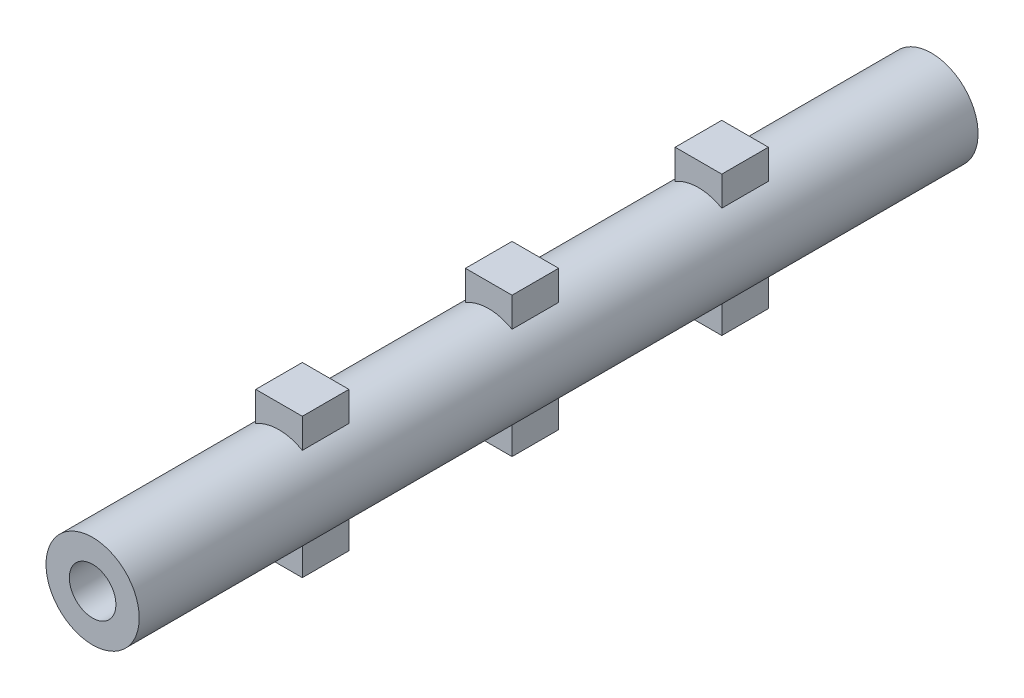
ISO-10303-21;
HEADER;
FILE_DESCRIPTION(('STEP AP214'),'2;1');
FILE_NAME('part.step','',(''),(''),'','','');
FILE_SCHEMA(('AUTOMOTIVE_DESIGN { 1 0 10303 214 1 1 1 1 }'));
ENDSEC;
DATA;
#1=APPLICATION_CONTEXT('core data for automotive mechanical design processes');
#2=APPLICATION_PROTOCOL_DEFINITION('international standard','automotive_design',2000,#1);
#3=PRODUCT_CONTEXT('',#1,'mechanical');
#4=PRODUCT('Part','Part','',(#3));
#5=PRODUCT_RELATED_PRODUCT_CATEGORY('part','',(#4));
#6=PRODUCT_DEFINITION_FORMATION('','',#4);
#7=PRODUCT_DEFINITION_CONTEXT('part definition',#1,'design');
#8=PRODUCT_DEFINITION('design','',#6,#7);
#9=PRODUCT_DEFINITION_SHAPE('','',#8);
#10=(LENGTH_UNIT() NAMED_UNIT(*) SI_UNIT(.MILLI.,.METRE.));
#11=(NAMED_UNIT(*) PLANE_ANGLE_UNIT() SI_UNIT($,.RADIAN.));
#12=(NAMED_UNIT(*) SI_UNIT($,.STERADIAN.) SOLID_ANGLE_UNIT());
#13=UNCERTAINTY_MEASURE_WITH_UNIT(LENGTH_MEASURE(1.E-05),#10,'distance_accuracy_value','');
#14=(GEOMETRIC_REPRESENTATION_CONTEXT(3) GLOBAL_UNCERTAINTY_ASSIGNED_CONTEXT((#13)) GLOBAL_UNIT_ASSIGNED_CONTEXT((#10,
#11,#12)) REPRESENTATION_CONTEXT('',''));
#15=CARTESIAN_POINT('',(0.,0.,0.));
#16=DIRECTION('',(0.,0.,1.));
#17=DIRECTION('',(1.,0.,0.));
#18=AXIS2_PLACEMENT_3D('',#15,#16,#17);
#19=CARTESIAN_POINT('',(0.,0.,25.));
#20=DIRECTION('',(0.,0.,1.));
#21=DIRECTION('',(1.,0.,0.));
#22=AXIS2_PLACEMENT_3D('',#19,#20,#21);
#23=PLANE('',#22);
#24=CARTESIAN_POINT('',(0.,0.,25.));
#25=DIRECTION('',(0.,0.,1.));
#26=DIRECTION('',(1.,0.,0.));
#27=AXIS2_PLACEMENT_3D('',#24,#25,#26);
#28=CIRCLE('',#27,5.);
#29=CARTESIAN_POINT('',(2.5,4.33012701892219,25.));
#30=VERTEX_POINT('',#29);
#31=CARTESIAN_POINT('',(-2.5,4.33012701892219,25.));
#32=VERTEX_POINT('',#31);
#33=EDGE_CURVE('E51',#30,#32,#28,.T.);
#34=ORIENTED_EDGE('',*,*,#33,.F.);
#35=DIRECTION('',(0.,1.,0.));
#36=VECTOR('',#35,1.);
#37=CARTESIAN_POINT('',(2.5,-7.5,25.));
#38=LINE('',#37,#36);
#39=CARTESIAN_POINT('',(2.5,7.5,25.));
#40=VERTEX_POINT('',#39);
#41=EDGE_CURVE('E220',#30,#40,#38,.T.);
#42=ORIENTED_EDGE('',*,*,#41,.T.);
#43=DIRECTION('',(-1.,0.,0.));
#44=VECTOR('',#43,1.);
#45=CARTESIAN_POINT('',(-2.5,7.5,25.));
#46=LINE('',#45,#44);
#47=CARTESIAN_POINT('',(-2.5,7.5,25.));
#48=VERTEX_POINT('',#47);
#49=EDGE_CURVE('E392',#40,#48,#46,.T.);
#50=ORIENTED_EDGE('',*,*,#49,.T.);
#51=DIRECTION('',(0.,-1.,0.));
#52=VECTOR('',#51,1.);
#53=CARTESIAN_POINT('',(-2.5,-7.5,25.));
#54=LINE('',#53,#52);
#55=EDGE_CURVE('E232',#48,#32,#54,.T.);
#56=ORIENTED_EDGE('',*,*,#55,.T.);
#57=EDGE_LOOP('',(#34,#42,#50,#56));
#58=FACE_BOUND('',#57,.T.);
#59=ADVANCED_FACE('F39',(#58),#23,.T.);
#60=CARTESIAN_POINT('',(0.,0.,-25.));
#61=DIRECTION('',(0.,0.,-1.));
#62=DIRECTION('',(-1.,0.,0.));
#63=AXIS2_PLACEMENT_3D('',#60,#61,#62);
#64=PLANE('',#63);
#65=CARTESIAN_POINT('',(0.,0.,-25.));
#66=DIRECTION('',(0.,0.,-1.));
#67=DIRECTION('',(-1.,0.,0.));
#68=AXIS2_PLACEMENT_3D('',#65,#66,#67);
#69=CIRCLE('',#68,5.);
#70=CARTESIAN_POINT('',(-2.5,4.33012701892219,-25.));
#71=VERTEX_POINT('',#70);
#72=CARTESIAN_POINT('',(2.5,4.33012701892219,-25.));
#73=VERTEX_POINT('',#72);
#74=EDGE_CURVE('E240',#71,#73,#69,.T.);
#75=ORIENTED_EDGE('',*,*,#74,.F.);
#76=DIRECTION('',(0.,1.,0.));
#77=VECTOR('',#76,1.);
#78=CARTESIAN_POINT('',(-2.5,-7.5,-25.));
#79=LINE('',#78,#77);
#80=CARTESIAN_POINT('',(-2.5,7.5,-25.));
#81=VERTEX_POINT('',#80);
#82=EDGE_CURVE('E278',#71,#81,#79,.T.);
#83=ORIENTED_EDGE('',*,*,#82,.T.);
#84=DIRECTION('',(1.,0.,0.));
#85=VECTOR('',#84,1.);
#86=CARTESIAN_POINT('',(-2.5,7.5,-25.));
#87=LINE('',#86,#85);
#88=CARTESIAN_POINT('',(2.5,7.5,-25.));
#89=VERTEX_POINT('',#88);
#90=EDGE_CURVE('E281',#81,#89,#87,.T.);
#91=ORIENTED_EDGE('',*,*,#90,.T.);
#92=DIRECTION('',(0.,-1.,0.));
#93=VECTOR('',#92,1.);
#94=CARTESIAN_POINT('',(2.5,-7.5,-25.));
#95=LINE('',#94,#93);
#96=EDGE_CURVE('E66',#89,#73,#95,.T.);
#97=ORIENTED_EDGE('',*,*,#96,.T.);
#98=EDGE_LOOP('',(#75,#83,#91,#97));
#99=FACE_BOUND('',#98,.T.);
#100=ADVANCED_FACE('F500',(#99),#64,.T.);
#101=CARTESIAN_POINT('',(2.5,-7.5,2.5));
#102=DIRECTION('',(1.,0.,0.));
#103=DIRECTION('',(0.,0.,-1.));
#104=AXIS2_PLACEMENT_3D('',#101,#102,#103);
#105=PLANE('',#104);
#106=DIRECTION('',(0.,0.,-1.));
#107=VECTOR('',#106,1.);
#108=CARTESIAN_POINT('',(2.5,4.33012701892219,25.));
#109=LINE('',#108,#107);
#110=CARTESIAN_POINT('',(2.5,4.33012701892219,-2.5));
#111=VERTEX_POINT('',#110);
#112=CARTESIAN_POINT('',(2.5,4.33012701892219,2.5));
#113=VERTEX_POINT('',#112);
#114=EDGE_CURVE('E352',#111,#113,#109,.F.);
#115=ORIENTED_EDGE('',*,*,#114,.F.);
#116=DIRECTION('',(0.,-1.,0.));
#117=VECTOR('',#116,1.);
#118=CARTESIAN_POINT('',(2.5,-7.5,-2.5));
#119=LINE('',#118,#117);
#120=CARTESIAN_POINT('',(2.5,7.5,-2.5));
#121=VERTEX_POINT('',#120);
#122=EDGE_CURVE('E322',#121,#111,#119,.T.);
#123=ORIENTED_EDGE('',*,*,#122,.F.);
#124=DIRECTION('',(0.,0.,-1.));
#125=VECTOR('',#124,1.);
#126=CARTESIAN_POINT('',(2.5,7.5,2.5));
#127=LINE('',#126,#125);
#128=CARTESIAN_POINT('',(2.5,7.5,2.5));
#129=VERTEX_POINT('',#128);
#130=EDGE_CURVE('E357',#129,#121,#127,.T.);
#131=ORIENTED_EDGE('',*,*,#130,.F.);
#132=DIRECTION('',(0.,-1.,0.));
#133=VECTOR('',#132,1.);
#134=CARTESIAN_POINT('',(2.5,-7.5,2.5));
#135=LINE('',#134,#133);
#136=EDGE_CURVE('E340',#129,#113,#135,.T.);
#137=ORIENTED_EDGE('',*,*,#136,.T.);
#138=EDGE_LOOP('',(#115,#123,#131,#137));
#139=FACE_BOUND('',#138,.T.);
#140=ADVANCED_FACE('F505',(#139),#105,.T.);
#141=CARTESIAN_POINT('',(2.5,-4.33012701892219,-2.5));
#142=VERTEX_POINT('',#141);
#143=CARTESIAN_POINT('',(2.5,-7.5,-2.5));
#144=VERTEX_POINT('',#143);
#145=EDGE_CURVE('E321',#142,#144,#119,.T.);
#146=ORIENTED_EDGE('',*,*,#145,.F.);
#147=DIRECTION('',(0.,0.,-1.));
#148=VECTOR('',#147,1.);
#149=CARTESIAN_POINT('',(2.5,-4.33012701892219,25.));
#150=LINE('',#149,#148);
#151=CARTESIAN_POINT('',(2.5,-4.33012701892219,2.5));
#152=VERTEX_POINT('',#151);
#153=EDGE_CURVE('E365',#152,#142,#150,.T.);
#154=ORIENTED_EDGE('',*,*,#153,.F.);
#155=CARTESIAN_POINT('',(2.5,-7.5,2.5));
#156=VERTEX_POINT('',#155);
#157=EDGE_CURVE('E339',#152,#156,#135,.T.);
#158=ORIENTED_EDGE('',*,*,#157,.T.);
#159=DIRECTION('',(0.,0.,-1.));
#160=VECTOR('',#159,1.);
#161=CARTESIAN_POINT('',(2.5,-7.5,2.5));
#162=LINE('',#161,#160);
#163=EDGE_CURVE('E353',#156,#144,#162,.T.);
#164=ORIENTED_EDGE('',*,*,#163,.T.);
#165=EDGE_LOOP('',(#146,#154,#158,#164));
#166=FACE_BOUND('',#165,.T.);
#167=ADVANCED_FACE('F561',(#166),#105,.T.);
#168=CARTESIAN_POINT('',(-2.5,-7.5,2.5));
#169=DIRECTION('',(-1.,0.,0.));
#170=DIRECTION('',(0.,0.,1.));
#171=AXIS2_PLACEMENT_3D('',#168,#169,#170);
#172=PLANE('',#171);
#173=DIRECTION('',(0.,0.,-1.));
#174=VECTOR('',#173,1.);
#175=CARTESIAN_POINT('',(-2.5,-4.33012701892219,25.));
#176=LINE('',#175,#174);
#177=CARTESIAN_POINT('',(-2.5,-4.33012701892219,-2.5));
#178=VERTEX_POINT('',#177);
#179=CARTESIAN_POINT('',(-2.5,-4.33012701892219,2.5));
#180=VERTEX_POINT('',#179);
#181=EDGE_CURVE('E368',#178,#180,#176,.F.);
#182=ORIENTED_EDGE('',*,*,#181,.F.);
#183=DIRECTION('',(0.,1.,0.));
#184=VECTOR('',#183,1.);
#185=CARTESIAN_POINT('',(-2.5,-7.5,-2.5));
#186=LINE('',#185,#184);
#187=CARTESIAN_POINT('',(-2.5,-7.5,-2.5));
#188=VERTEX_POINT('',#187);
#189=EDGE_CURVE('E313',#188,#178,#186,.T.);
#190=ORIENTED_EDGE('',*,*,#189,.F.);
#191=DIRECTION('',(0.,0.,-1.));
#192=VECTOR('',#191,1.);
#193=CARTESIAN_POINT('',(-2.5,-7.5,2.5));
#194=LINE('',#193,#192);
#195=CARTESIAN_POINT('',(-2.5,-7.5,2.5));
#196=VERTEX_POINT('',#195);
#197=EDGE_CURVE('E349',#196,#188,#194,.T.);
#198=ORIENTED_EDGE('',*,*,#197,.F.);
#199=DIRECTION('',(0.,1.,0.));
#200=VECTOR('',#199,1.);
#201=CARTESIAN_POINT('',(-2.5,-7.5,2.5));
#202=LINE('',#201,#200);
#203=EDGE_CURVE('E331',#196,#180,#202,.T.);
#204=ORIENTED_EDGE('',*,*,#203,.T.);
#205=EDGE_LOOP('',(#182,#190,#198,#204));
#206=FACE_BOUND('',#205,.T.);
#207=ADVANCED_FACE('F558',(#206),#172,.T.);
#208=CARTESIAN_POINT('',(-2.5,4.33012701892219,-2.5));
#209=VERTEX_POINT('',#208);
#210=CARTESIAN_POINT('',(-2.5,7.5,-2.5));
#211=VERTEX_POINT('',#210);
#212=EDGE_CURVE('E312',#209,#211,#186,.T.);
#213=ORIENTED_EDGE('',*,*,#212,.F.);
#214=DIRECTION('',(0.,0.,-1.));
#215=VECTOR('',#214,1.);
#216=CARTESIAN_POINT('',(-2.5,4.33012701892219,25.));
#217=LINE('',#216,#215);
#218=CARTESIAN_POINT('',(-2.5,4.33012701892219,2.5));
#219=VERTEX_POINT('',#218);
#220=EDGE_CURVE('E229',#219,#209,#217,.T.);
#221=ORIENTED_EDGE('',*,*,#220,.F.);
#222=CARTESIAN_POINT('',(-2.5,7.5,2.5));
#223=VERTEX_POINT('',#222);
#224=EDGE_CURVE('E330',#219,#223,#202,.T.);
#225=ORIENTED_EDGE('',*,*,#224,.T.);
#226=DIRECTION('',(0.,0.,-1.));
#227=VECTOR('',#226,1.);
#228=CARTESIAN_POINT('',(-2.5,7.5,2.5));
#229=LINE('',#228,#227);
#230=EDGE_CURVE('E348',#223,#211,#229,.T.);
#231=ORIENTED_EDGE('',*,*,#230,.T.);
#232=EDGE_LOOP('',(#213,#221,#225,#231));
#233=FACE_BOUND('',#232,.T.);
#234=ADVANCED_FACE('F447',(#233),#172,.T.);
#235=CARTESIAN_POINT('',(0.,0.,-2.5));
#236=DIRECTION('',(0.,0.,1.));
#237=DIRECTION('',(1.,0.,0.));
#238=AXIS2_PLACEMENT_3D('',#235,#236,#237);
#239=PLANE('',#238);
#240=CARTESIAN_POINT('',(0.,0.,-2.5));
#241=DIRECTION('',(0.,0.,1.));
#242=DIRECTION('',(1.,0.,0.));
#243=AXIS2_PLACEMENT_3D('',#240,#241,#242);
#244=CIRCLE('',#243,5.);
#245=EDGE_CURVE('E433',#142,#178,#244,.F.);
#246=ORIENTED_EDGE('',*,*,#245,.F.);
#247=ORIENTED_EDGE('',*,*,#145,.T.);
#248=DIRECTION('',(-1.,0.,0.));
#249=VECTOR('',#248,1.);
#250=CARTESIAN_POINT('',(2.5,-7.5,-2.5));
#251=LINE('',#250,#249);
#252=EDGE_CURVE('E326',#144,#188,#251,.T.);
#253=ORIENTED_EDGE('',*,*,#252,.T.);
#254=ORIENTED_EDGE('',*,*,#189,.T.);
#255=EDGE_LOOP('',(#246,#247,#253,#254));
#256=FACE_BOUND('',#255,.T.);
#257=ADVANCED_FACE('F518',(#256),#239,.F.);
#258=CARTESIAN_POINT('',(0.,0.,25.));
#259=DIRECTION('',(0.,0.,-1.));
#260=DIRECTION('',(-1.,0.,0.));
#261=AXIS2_PLACEMENT_3D('',#258,#259,#260);
#262=CYLINDRICAL_SURFACE('',#261,5.);
#263=DIRECTION('',(0.,0.,-1.));
#264=VECTOR('',#263,1.);
#265=CARTESIAN_POINT('',(-2.5,-4.33012701892219,25.));
#266=LINE('',#265,#264);
#267=CARTESIAN_POINT('',(-2.5,-4.33012701892219,20.));
#268=VERTEX_POINT('',#267);
#269=CARTESIAN_POINT('',(-2.5,-4.33012701892219,25.));
#270=VERTEX_POINT('',#269);
#271=EDGE_CURVE('E405',#268,#270,#266,.F.);
#272=ORIENTED_EDGE('',*,*,#271,.T.);
#273=CARTESIAN_POINT('',(2.5,-4.33012701892219,25.));
#274=VERTEX_POINT('',#273);
#275=EDGE_CURVE('E11',#270,#274,#28,.T.);
#276=ORIENTED_EDGE('',*,*,#275,.T.);
#277=DIRECTION('',(0.,0.,-1.));
#278=VECTOR('',#277,1.);
#279=CARTESIAN_POINT('',(2.5,-4.33012701892219,25.));
#280=LINE('',#279,#278);
#281=CARTESIAN_POINT('',(2.5,-4.33012701892219,20.));
#282=VERTEX_POINT('',#281);
#283=EDGE_CURVE('E216',#274,#282,#280,.T.);
#284=ORIENTED_EDGE('',*,*,#283,.T.);
#285=CARTESIAN_POINT('',(0.,0.,20.));
#286=DIRECTION('',(0.,0.,-1.));
#287=DIRECTION('',(-1.,0.,0.));
#288=AXIS2_PLACEMENT_3D('',#285,#286,#287);
#289=CIRCLE('',#288,5.);
#290=EDGE_CURVE('E423',#282,#268,#289,.T.);
#291=ORIENTED_EDGE('',*,*,#290,.T.);
#292=EDGE_LOOP('',(#272,#276,#284,#291));
#293=FACE_BOUND('',#292,.T.);
#294=DIRECTION('',(0.,0.,-1.));
#295=VECTOR('',#294,1.);
#296=CARTESIAN_POINT('',(2.5,-4.33012701892219,25.));
#297=LINE('',#296,#295);
#298=CARTESIAN_POINT('',(2.5,-4.33012701892219,-20.));
#299=VERTEX_POINT('',#298);
#300=CARTESIAN_POINT('',(2.5,-4.33012701892219,-25.));
#301=VERTEX_POINT('',#300);
#302=EDGE_CURVE('E308',#299,#301,#297,.T.);
#303=ORIENTED_EDGE('',*,*,#302,.T.);
#304=CARTESIAN_POINT('',(-2.5,-4.33012701892219,-25.));
#305=VERTEX_POINT('',#304);
#306=EDGE_CURVE('E49',#301,#305,#69,.T.);
#307=ORIENTED_EDGE('',*,*,#306,.T.);
#308=DIRECTION('',(0.,0.,-1.));
#309=VECTOR('',#308,1.);
#310=CARTESIAN_POINT('',(-2.5,-4.33012701892219,25.));
#311=LINE('',#310,#309);
#312=CARTESIAN_POINT('',(-2.5,-4.33012701892219,-20.));
#313=VERTEX_POINT('',#312);
#314=EDGE_CURVE('E287',#305,#313,#311,.F.);
#315=ORIENTED_EDGE('',*,*,#314,.T.);
#316=CARTESIAN_POINT('',(0.,0.,-20.));
#317=DIRECTION('',(0.,0.,-1.));
#318=DIRECTION('',(-1.,0.,0.));
#319=AXIS2_PLACEMENT_3D('',#316,#317,#318);
#320=CIRCLE('',#319,5.);
#321=EDGE_CURVE('E43',#299,#313,#320,.T.);
#322=ORIENTED_EDGE('',*,*,#321,.F.);
#323=EDGE_LOOP('',(#303,#307,#315,#322));
#324=FACE_BOUND('',#323,.T.);
#325=ORIENTED_EDGE('',*,*,#74,.T.);
#326=DIRECTION('',(0.,0.,-1.));
#327=VECTOR('',#326,1.);
#328=CARTESIAN_POINT('',(2.5,4.33012701892219,25.));
#329=LINE('',#328,#327);
#330=CARTESIAN_POINT('',(2.5,4.33012701892219,-20.));
#331=VERTEX_POINT('',#330);
#332=EDGE_CURVE('E304',#73,#331,#329,.F.);
#333=ORIENTED_EDGE('',*,*,#332,.T.);
#334=CARTESIAN_POINT('',(-2.5,4.33012701892219,-20.));
#335=VERTEX_POINT('',#334);
#336=EDGE_CURVE('E476',#335,#331,#320,.T.);
#337=ORIENTED_EDGE('',*,*,#336,.F.);
#338=DIRECTION('',(0.,0.,-1.));
#339=VECTOR('',#338,1.);
#340=CARTESIAN_POINT('',(-2.5,4.33012701892219,25.));
#341=LINE('',#340,#339);
#342=EDGE_CURVE('E301',#335,#71,#341,.T.);
#343=ORIENTED_EDGE('',*,*,#342,.T.);
#344=EDGE_LOOP('',(#325,#333,#337,#343));
#345=FACE_BOUND('',#344,.T.);
#346=EDGE_CURVE('E430',#209,#111,#244,.F.);
#347=ORIENTED_EDGE('',*,*,#346,.T.);
#348=ORIENTED_EDGE('',*,*,#114,.T.);
#349=CARTESIAN_POINT('',(0.,0.,2.5));
#350=DIRECTION('',(0.,0.,1.));
#351=DIRECTION('',(1.,0.,0.));
#352=AXIS2_PLACEMENT_3D('',#349,#350,#351);
#353=CIRCLE('',#352,5.);
#354=EDGE_CURVE('E429',#113,#219,#353,.T.);
#355=ORIENTED_EDGE('',*,*,#354,.T.);
#356=ORIENTED_EDGE('',*,*,#220,.T.);
#357=EDGE_LOOP('',(#347,#348,#355,#356));
#358=FACE_BOUND('',#357,.T.);
#359=ORIENTED_EDGE('',*,*,#153,.T.);
#360=ORIENTED_EDGE('',*,*,#245,.T.);
#361=ORIENTED_EDGE('',*,*,#181,.T.);
#362=EDGE_CURVE('E427',#180,#152,#353,.T.);
#363=ORIENTED_EDGE('',*,*,#362,.T.);
#364=EDGE_LOOP('',(#359,#360,#361,#363));
#365=FACE_BOUND('',#364,.T.);
#366=CARTESIAN_POINT('',(-2.5,4.33012701892219,20.));
#367=VERTEX_POINT('',#366);
#368=CARTESIAN_POINT('',(2.5,4.33012701892219,20.));
#369=VERTEX_POINT('',#368);
#370=EDGE_CURVE('E212',#367,#369,#289,.T.);
#371=ORIENTED_EDGE('',*,*,#370,.T.);
#372=DIRECTION('',(0.,0.,-1.));
#373=VECTOR('',#372,1.);
#374=CARTESIAN_POINT('',(2.5,4.33012701892219,25.));
#375=LINE('',#374,#373);
#376=EDGE_CURVE('E207',#369,#30,#375,.F.);
#377=ORIENTED_EDGE('',*,*,#376,.T.);
#378=ORIENTED_EDGE('',*,*,#33,.T.);
#379=DIRECTION('',(0.,0.,-1.));
#380=VECTOR('',#379,1.);
#381=CARTESIAN_POINT('',(-2.5,4.33012701892219,25.));
#382=LINE('',#381,#380);
#383=EDGE_CURVE('E217',#32,#367,#382,.T.);
#384=ORIENTED_EDGE('',*,*,#383,.T.);
#385=EDGE_LOOP('',(#371,#377,#378,#384));
#386=FACE_BOUND('',#385,.T.);
#387=CARTESIAN_POINT('',(0.,0.,-45.));
#388=DIRECTION('',(0.,0.,-1.));
#389=DIRECTION('',(-1.,0.,0.));
#390=AXIS2_PLACEMENT_3D('',#387,#388,#389);
#391=CIRCLE('',#390,5.);
#392=CARTESIAN_POINT('',(-5.,0.,-45.));
#393=VERTEX_POINT('',#392);
#394=EDGE_CURVE('E246',#393,#393,#391,.T.);
#395=ORIENTED_EDGE('',*,*,#394,.F.);
#396=EDGE_LOOP('',(#395));
#397=FACE_BOUND('',#396,.T.);
#398=CARTESIAN_POINT('',(0.,0.,45.));
#399=DIRECTION('',(0.,0.,1.));
#400=DIRECTION('',(1.,0.,0.));
#401=AXIS2_PLACEMENT_3D('',#398,#399,#400);
#402=CIRCLE('',#401,5.);
#403=CARTESIAN_POINT('',(5.,0.,45.));
#404=VERTEX_POINT('',#403);
#405=EDGE_CURVE('E235',#404,#404,#402,.T.);
#406=ORIENTED_EDGE('',*,*,#405,.F.);
#407=EDGE_LOOP('',(#406));
#408=FACE_BOUND('',#407,.T.);
#409=ADVANCED_FACE('F41',(#293,#324,#345,#358,#365,#386,#397,#408),#262,.T.);
#410=ORIENTED_EDGE('',*,*,#275,.F.);
#411=CARTESIAN_POINT('',(-2.5,-7.5,25.));
#412=VERTEX_POINT('',#411);
#413=EDGE_CURVE('E395',#270,#412,#54,.T.);
#414=ORIENTED_EDGE('',*,*,#413,.T.);
#415=DIRECTION('',(1.,0.,0.));
#416=VECTOR('',#415,1.);
#417=CARTESIAN_POINT('',(-2.5,-7.5,25.));
#418=LINE('',#417,#416);
#419=CARTESIAN_POINT('',(2.5,-7.5,25.));
#420=VERTEX_POINT('',#419);
#421=EDGE_CURVE('E398',#412,#420,#418,.T.);
#422=ORIENTED_EDGE('',*,*,#421,.T.);
#423=EDGE_CURVE('E228',#420,#274,#38,.T.);
#424=ORIENTED_EDGE('',*,*,#423,.T.);
#425=EDGE_LOOP('',(#410,#414,#422,#424));
#426=FACE_BOUND('',#425,.T.);
#427=ADVANCED_FACE('F501',(#426),#23,.T.);
#428=CARTESIAN_POINT('',(-2.5,-7.5,20.));
#429=DIRECTION('',(0.,-1.,0.));
#430=DIRECTION('',(0.,0.,-1.));
#431=AXIS2_PLACEMENT_3D('',#428,#429,#430);
#432=PLANE('',#431);
#433=ORIENTED_EDGE('',*,*,#421,.F.);
#434=DIRECTION('',(0.,0.,1.));
#435=VECTOR('',#434,1.);
#436=CARTESIAN_POINT('',(-2.5,-7.5,20.));
#437=LINE('',#436,#435);
#438=CARTESIAN_POINT('',(-2.5,-7.5,20.));
#439=VERTEX_POINT('',#438);
#440=EDGE_CURVE('E406',#439,#412,#437,.T.);
#441=ORIENTED_EDGE('',*,*,#440,.F.);
#442=DIRECTION('',(1.,0.,0.));
#443=VECTOR('',#442,1.);
#444=CARTESIAN_POINT('',(-2.5,-7.5,20.));
#445=LINE('',#444,#443);
#446=CARTESIAN_POINT('',(2.5,-7.5,20.));
#447=VERTEX_POINT('',#446);
#448=EDGE_CURVE('E387',#439,#447,#445,.T.);
#449=ORIENTED_EDGE('',*,*,#448,.T.);
#450=DIRECTION('',(0.,0.,1.));
#451=VECTOR('',#450,1.);
#452=CARTESIAN_POINT('',(2.5,-7.5,20.));
#453=LINE('',#452,#451);
#454=EDGE_CURVE('E402',#447,#420,#453,.T.);
#455=ORIENTED_EDGE('',*,*,#454,.T.);
#456=EDGE_LOOP('',(#433,#441,#449,#455));
#457=FACE_BOUND('',#456,.T.);
#458=ADVANCED_FACE('F509',(#457),#432,.T.);
#459=CARTESIAN_POINT('',(0.,0.,20.));
#460=DIRECTION('',(0.,0.,-1.));
#461=DIRECTION('',(-1.,0.,0.));
#462=AXIS2_PLACEMENT_3D('',#459,#460,#461);
#463=PLANE('',#462);
#464=ORIENTED_EDGE('',*,*,#290,.F.);
#465=DIRECTION('',(0.,1.,0.));
#466=VECTOR('',#465,1.);
#467=CARTESIAN_POINT('',(2.5,-7.5,20.));
#468=LINE('',#467,#466);
#469=EDGE_CURVE('E373',#447,#282,#468,.T.);
#470=ORIENTED_EDGE('',*,*,#469,.F.);
#471=ORIENTED_EDGE('',*,*,#448,.F.);
#472=DIRECTION('',(0.,-1.,0.));
#473=VECTOR('',#472,1.);
#474=CARTESIAN_POINT('',(-2.5,-7.5,20.));
#475=LINE('',#474,#473);
#476=EDGE_CURVE('E382',#268,#439,#475,.T.);
#477=ORIENTED_EDGE('',*,*,#476,.F.);
#478=EDGE_LOOP('',(#464,#470,#471,#477));
#479=FACE_BOUND('',#478,.T.);
#480=ADVANCED_FACE('F515',(#479),#463,.T.);
#481=CARTESIAN_POINT('',(-2.5,-7.5,20.));
#482=DIRECTION('',(-1.,0.,0.));
#483=DIRECTION('',(0.,0.,1.));
#484=AXIS2_PLACEMENT_3D('',#481,#482,#483);
#485=PLANE('',#484);
#486=ORIENTED_EDGE('',*,*,#271,.F.);
#487=ORIENTED_EDGE('',*,*,#476,.T.);
#488=ORIENTED_EDGE('',*,*,#440,.T.);
#489=ORIENTED_EDGE('',*,*,#413,.F.);
#490=EDGE_LOOP('',(#486,#487,#488,#489));
#491=FACE_BOUND('',#490,.T.);
#492=ADVANCED_FACE('F524',(#491),#485,.T.);
#493=CARTESIAN_POINT('',(2.5,-7.5,20.));
#494=DIRECTION('',(1.,0.,0.));
#495=DIRECTION('',(0.,0.,-1.));
#496=AXIS2_PLACEMENT_3D('',#493,#494,#495);
#497=PLANE('',#496);
#498=ORIENTED_EDGE('',*,*,#283,.F.);
#499=ORIENTED_EDGE('',*,*,#423,.F.);
#500=ORIENTED_EDGE('',*,*,#454,.F.);
#501=ORIENTED_EDGE('',*,*,#469,.T.);
#502=EDGE_LOOP('',(#498,#499,#500,#501));
#503=FACE_BOUND('',#502,.T.);
#504=ADVANCED_FACE('F533',(#503),#497,.T.);
#505=ORIENTED_EDGE('',*,*,#370,.F.);
#506=CARTESIAN_POINT('',(-2.5,7.5,20.));
#507=VERTEX_POINT('',#506);
#508=EDGE_CURVE('E383',#507,#367,#475,.T.);
#509=ORIENTED_EDGE('',*,*,#508,.F.);
#510=DIRECTION('',(-1.,0.,0.));
#511=VECTOR('',#510,1.);
#512=CARTESIAN_POINT('',(-2.5,7.5,20.));
#513=LINE('',#512,#511);
#514=CARTESIAN_POINT('',(2.5,7.5,20.));
#515=VERTEX_POINT('',#514);
#516=EDGE_CURVE('E377',#515,#507,#513,.T.);
#517=ORIENTED_EDGE('',*,*,#516,.F.);
#518=EDGE_CURVE('E378',#369,#515,#468,.T.);
#519=ORIENTED_EDGE('',*,*,#518,.F.);
#520=EDGE_LOOP('',(#505,#509,#517,#519));
#521=FACE_BOUND('',#520,.T.);
#522=ADVANCED_FACE('F535',(#521),#463,.T.);
#523=ORIENTED_EDGE('',*,*,#376,.F.);
#524=ORIENTED_EDGE('',*,*,#518,.T.);
#525=DIRECTION('',(0.,0.,1.));
#526=VECTOR('',#525,1.);
#527=CARTESIAN_POINT('',(2.5,7.5,20.));
#528=LINE('',#527,#526);
#529=EDGE_CURVE('E223',#515,#40,#528,.T.);
#530=ORIENTED_EDGE('',*,*,#529,.T.);
#531=ORIENTED_EDGE('',*,*,#41,.F.);
#532=EDGE_LOOP('',(#523,#524,#530,#531));
#533=FACE_BOUND('',#532,.T.);
#534=ADVANCED_FACE('F221',(#533),#497,.T.);
#535=ORIENTED_EDGE('',*,*,#383,.F.);
#536=ORIENTED_EDGE('',*,*,#55,.F.);
#537=DIRECTION('',(0.,0.,1.));
#538=VECTOR('',#537,1.);
#539=CARTESIAN_POINT('',(-2.5,7.5,20.));
#540=LINE('',#539,#538);
#541=EDGE_CURVE('E410',#507,#48,#540,.T.);
#542=ORIENTED_EDGE('',*,*,#541,.F.);
#543=ORIENTED_EDGE('',*,*,#508,.T.);
#544=EDGE_LOOP('',(#535,#536,#542,#543));
#545=FACE_BOUND('',#544,.T.);
#546=ADVANCED_FACE('F543',(#545),#485,.T.);
#547=CARTESIAN_POINT('',(-2.5,7.5,20.));
#548=DIRECTION('',(0.,1.,0.));
#549=DIRECTION('',(0.,0.,1.));
#550=AXIS2_PLACEMENT_3D('',#547,#548,#549);
#551=PLANE('',#550);
#552=ORIENTED_EDGE('',*,*,#49,.F.);
#553=ORIENTED_EDGE('',*,*,#529,.F.);
#554=ORIENTED_EDGE('',*,*,#516,.T.);
#555=ORIENTED_EDGE('',*,*,#541,.T.);
#556=EDGE_LOOP('',(#552,#553,#554,#555));
#557=FACE_BOUND('',#556,.T.);
#558=ADVANCED_FACE('F549',(#557),#551,.T.);
#559=CARTESIAN_POINT('',(2.5,-7.5,2.5));
#560=DIRECTION('',(0.,-1.,0.));
#561=DIRECTION('',(0.,0.,-1.));
#562=AXIS2_PLACEMENT_3D('',#559,#560,#561);
#563=PLANE('',#562);
#564=ORIENTED_EDGE('',*,*,#197,.T.);
#565=ORIENTED_EDGE('',*,*,#252,.F.);
#566=ORIENTED_EDGE('',*,*,#163,.F.);
#567=DIRECTION('',(-1.,0.,0.));
#568=VECTOR('',#567,1.);
#569=CARTESIAN_POINT('',(2.5,-7.5,2.5));
#570=LINE('',#569,#568);
#571=EDGE_CURVE('E344',#156,#196,#570,.T.);
#572=ORIENTED_EDGE('',*,*,#571,.T.);
#573=EDGE_LOOP('',(#564,#565,#566,#572));
#574=FACE_BOUND('',#573,.T.);
#575=ADVANCED_FACE('F554',(#574),#563,.T.);
#576=CARTESIAN_POINT('',(0.,0.,2.5));
#577=DIRECTION('',(0.,0.,1.));
#578=DIRECTION('',(1.,0.,0.));
#579=AXIS2_PLACEMENT_3D('',#576,#577,#578);
#580=PLANE('',#579);
#581=ORIENTED_EDGE('',*,*,#362,.F.);
#582=ORIENTED_EDGE('',*,*,#203,.F.);
#583=ORIENTED_EDGE('',*,*,#571,.F.);
#584=ORIENTED_EDGE('',*,*,#157,.F.);
#585=EDGE_LOOP('',(#581,#582,#583,#584));
#586=FACE_BOUND('',#585,.T.);
#587=ADVANCED_FACE('F573',(#586),#580,.T.);
#588=ORIENTED_EDGE('',*,*,#354,.F.);
#589=ORIENTED_EDGE('',*,*,#136,.F.);
#590=DIRECTION('',(1.,0.,0.));
#591=VECTOR('',#590,1.);
#592=CARTESIAN_POINT('',(2.5,7.5,2.5));
#593=LINE('',#592,#591);
#594=EDGE_CURVE('E335',#223,#129,#593,.T.);
#595=ORIENTED_EDGE('',*,*,#594,.F.);
#596=ORIENTED_EDGE('',*,*,#224,.F.);
#597=EDGE_LOOP('',(#588,#589,#595,#596));
#598=FACE_BOUND('',#597,.T.);
#599=ADVANCED_FACE('F450',(#598),#580,.T.);
#600=CARTESIAN_POINT('',(2.5,7.5,2.5));
#601=DIRECTION('',(0.,1.,0.));
#602=DIRECTION('',(0.,0.,1.));
#603=AXIS2_PLACEMENT_3D('',#600,#601,#602);
#604=PLANE('',#603);
#605=ORIENTED_EDGE('',*,*,#130,.T.);
#606=DIRECTION('',(1.,0.,0.));
#607=VECTOR('',#606,1.);
#608=CARTESIAN_POINT('',(2.5,7.5,-2.5));
#609=LINE('',#608,#607);
#610=EDGE_CURVE('E317',#211,#121,#609,.T.);
#611=ORIENTED_EDGE('',*,*,#610,.F.);
#612=ORIENTED_EDGE('',*,*,#230,.F.);
#613=ORIENTED_EDGE('',*,*,#594,.T.);
#614=EDGE_LOOP('',(#605,#611,#612,#613));
#615=FACE_BOUND('',#614,.T.);
#616=ADVANCED_FACE('F563',(#615),#604,.T.);
#617=ORIENTED_EDGE('',*,*,#346,.F.);
#618=ORIENTED_EDGE('',*,*,#212,.T.);
#619=ORIENTED_EDGE('',*,*,#610,.T.);
#620=ORIENTED_EDGE('',*,*,#122,.T.);
#621=EDGE_LOOP('',(#617,#618,#619,#620));
#622=FACE_BOUND('',#621,.T.);
#623=ADVANCED_FACE('F566',(#622),#239,.F.);
#624=ORIENTED_EDGE('',*,*,#306,.F.);
#625=CARTESIAN_POINT('',(2.5,-7.5,-25.));
#626=VERTEX_POINT('',#625);
#627=EDGE_CURVE('E250',#301,#626,#95,.T.);
#628=ORIENTED_EDGE('',*,*,#627,.T.);
#629=DIRECTION('',(-1.,0.,0.));
#630=VECTOR('',#629,1.);
#631=CARTESIAN_POINT('',(-2.5,-7.5,-25.));
#632=LINE('',#631,#630);
#633=CARTESIAN_POINT('',(-2.5,-7.5,-25.));
#634=VERTEX_POINT('',#633);
#635=EDGE_CURVE('E275',#626,#634,#632,.T.);
#636=ORIENTED_EDGE('',*,*,#635,.T.);
#637=EDGE_CURVE('E58',#634,#305,#79,.T.);
#638=ORIENTED_EDGE('',*,*,#637,.T.);
#639=EDGE_LOOP('',(#624,#628,#636,#638));
#640=FACE_BOUND('',#639,.T.);
#641=ADVANCED_FACE('F459',(#640),#64,.T.);
#642=CARTESIAN_POINT('',(-2.5,-7.5,-20.));
#643=DIRECTION('',(0.,-1.,0.));
#644=DIRECTION('',(1.,0.,0.));
#645=AXIS2_PLACEMENT_3D('',#642,#643,#644);
#646=PLANE('',#645);
#647=ORIENTED_EDGE('',*,*,#635,.F.);
#648=DIRECTION('',(0.,0.,-1.));
#649=VECTOR('',#648,1.);
#650=CARTESIAN_POINT('',(2.5,-7.5,-20.));
#651=LINE('',#650,#649);
#652=CARTESIAN_POINT('',(2.5,-7.5,-20.));
#653=VERTEX_POINT('',#652);
#654=EDGE_CURVE('E272',#653,#626,#651,.T.);
#655=ORIENTED_EDGE('',*,*,#654,.F.);
#656=DIRECTION('',(-1.,0.,0.));
#657=VECTOR('',#656,1.);
#658=CARTESIAN_POINT('',(-2.5,-7.5,-20.));
#659=LINE('',#658,#657);
#660=CARTESIAN_POINT('',(-2.5,-7.5,-20.));
#661=VERTEX_POINT('',#660);
#662=EDGE_CURVE('E258',#653,#661,#659,.T.);
#663=ORIENTED_EDGE('',*,*,#662,.T.);
#664=DIRECTION('',(0.,0.,-1.));
#665=VECTOR('',#664,1.);
#666=CARTESIAN_POINT('',(-2.5,-7.5,-20.));
#667=LINE('',#666,#665);
#668=EDGE_CURVE('E292',#661,#634,#667,.T.);
#669=ORIENTED_EDGE('',*,*,#668,.T.);
#670=EDGE_LOOP('',(#647,#655,#663,#669));
#671=FACE_BOUND('',#670,.T.);
#672=ADVANCED_FACE('F468',(#671),#646,.T.);
#673=CARTESIAN_POINT('',(0.,0.,-20.));
#674=DIRECTION('',(0.,0.,-1.));
#675=DIRECTION('',(-1.,0.,0.));
#676=AXIS2_PLACEMENT_3D('',#673,#674,#675);
#677=PLANE('',#676);
#678=DIRECTION('',(0.,-1.,0.));
#679=VECTOR('',#678,1.);
#680=CARTESIAN_POINT('',(2.5,-7.5,-20.));
#681=LINE('',#680,#679);
#682=EDGE_CURVE('E259',#299,#653,#681,.T.);
#683=ORIENTED_EDGE('',*,*,#682,.F.);
#684=ORIENTED_EDGE('',*,*,#321,.T.);
#685=DIRECTION('',(0.,1.,0.));
#686=VECTOR('',#685,1.);
#687=CARTESIAN_POINT('',(-2.5,-7.5,-20.));
#688=LINE('',#687,#686);
#689=EDGE_CURVE('E264',#661,#313,#688,.T.);
#690=ORIENTED_EDGE('',*,*,#689,.F.);
#691=ORIENTED_EDGE('',*,*,#662,.F.);
#692=EDGE_LOOP('',(#683,#684,#690,#691));
#693=FACE_BOUND('',#692,.T.);
#694=ADVANCED_FACE('F484',(#693),#677,.F.);
#695=CARTESIAN_POINT('',(-2.5,-7.5,-20.));
#696=DIRECTION('',(-1.,0.,0.));
#697=DIRECTION('',(0.,0.,1.));
#698=AXIS2_PLACEMENT_3D('',#695,#696,#697);
#699=PLANE('',#698);
#700=ORIENTED_EDGE('',*,*,#314,.F.);
#701=ORIENTED_EDGE('',*,*,#637,.F.);
#702=ORIENTED_EDGE('',*,*,#668,.F.);
#703=ORIENTED_EDGE('',*,*,#689,.T.);
#704=EDGE_LOOP('',(#700,#701,#702,#703));
#705=FACE_BOUND('',#704,.T.);
#706=ADVANCED_FACE('F471',(#705),#699,.T.);
#707=CARTESIAN_POINT('',(2.5,-7.5,-20.));
#708=DIRECTION('',(1.,0.,0.));
#709=DIRECTION('',(0.,0.,-1.));
#710=AXIS2_PLACEMENT_3D('',#707,#708,#709);
#711=PLANE('',#710);
#712=ORIENTED_EDGE('',*,*,#302,.F.);
#713=ORIENTED_EDGE('',*,*,#682,.T.);
#714=ORIENTED_EDGE('',*,*,#654,.T.);
#715=ORIENTED_EDGE('',*,*,#627,.F.);
#716=EDGE_LOOP('',(#712,#713,#714,#715));
#717=FACE_BOUND('',#716,.T.);
#718=ADVANCED_FACE('F464',(#717),#711,.T.);
#719=CARTESIAN_POINT('',(-2.5,7.5,-20.));
#720=VERTEX_POINT('',#719);
#721=EDGE_CURVE('E263',#335,#720,#688,.T.);
#722=ORIENTED_EDGE('',*,*,#721,.F.);
#723=ORIENTED_EDGE('',*,*,#336,.T.);
#724=CARTESIAN_POINT('',(2.5,7.5,-20.));
#725=VERTEX_POINT('',#724);
#726=EDGE_CURVE('E254',#725,#331,#681,.T.);
#727=ORIENTED_EDGE('',*,*,#726,.F.);
#728=DIRECTION('',(1.,0.,0.));
#729=VECTOR('',#728,1.);
#730=CARTESIAN_POINT('',(-2.5,7.5,-20.));
#731=LINE('',#730,#729);
#732=EDGE_CURVE('E268',#720,#725,#731,.T.);
#733=ORIENTED_EDGE('',*,*,#732,.F.);
#734=EDGE_LOOP('',(#722,#723,#727,#733));
#735=FACE_BOUND('',#734,.T.);
#736=ADVANCED_FACE('F487',(#735),#677,.F.);
#737=ORIENTED_EDGE('',*,*,#332,.F.);
#738=ORIENTED_EDGE('',*,*,#96,.F.);
#739=DIRECTION('',(0.,0.,-1.));
#740=VECTOR('',#739,1.);
#741=CARTESIAN_POINT('',(2.5,7.5,-20.));
#742=LINE('',#741,#740);
#743=EDGE_CURVE('E284',#725,#89,#742,.T.);
#744=ORIENTED_EDGE('',*,*,#743,.F.);
#745=ORIENTED_EDGE('',*,*,#726,.T.);
#746=EDGE_LOOP('',(#737,#738,#744,#745));
#747=FACE_BOUND('',#746,.T.);
#748=ADVANCED_FACE('F498',(#747),#711,.T.);
#749=ORIENTED_EDGE('',*,*,#342,.F.);
#750=ORIENTED_EDGE('',*,*,#721,.T.);
#751=DIRECTION('',(0.,0.,-1.));
#752=VECTOR('',#751,1.);
#753=CARTESIAN_POINT('',(-2.5,7.5,-20.));
#754=LINE('',#753,#752);
#755=EDGE_CURVE('E288',#720,#81,#754,.T.);
#756=ORIENTED_EDGE('',*,*,#755,.T.);
#757=ORIENTED_EDGE('',*,*,#82,.F.);
#758=EDGE_LOOP('',(#749,#750,#756,#757));
#759=FACE_BOUND('',#758,.T.);
#760=ADVANCED_FACE('F493',(#759),#699,.T.);
#761=CARTESIAN_POINT('',(-2.5,7.5,-20.));
#762=DIRECTION('',(0.,1.,0.));
#763=DIRECTION('',(0.,0.,1.));
#764=AXIS2_PLACEMENT_3D('',#761,#762,#763);
#765=PLANE('',#764);
#766=ORIENTED_EDGE('',*,*,#90,.F.);
#767=ORIENTED_EDGE('',*,*,#755,.F.);
#768=ORIENTED_EDGE('',*,*,#732,.T.);
#769=ORIENTED_EDGE('',*,*,#743,.T.);
#770=EDGE_LOOP('',(#766,#767,#768,#769));
#771=FACE_BOUND('',#770,.T.);
#772=ADVANCED_FACE('F584',(#771),#765,.T.);
#773=CARTESIAN_POINT('',(0.,0.,-45.));
#774=DIRECTION('',(0.,0.,-1.));
#775=DIRECTION('',(-1.,0.,0.));
#776=AXIS2_PLACEMENT_3D('',#773,#774,#775);
#777=PLANE('',#776);
#778=CARTESIAN_POINT('',(0.,0.,-45.));
#779=DIRECTION('',(0.,0.,-1.));
#780=DIRECTION('',(-1.,0.,0.));
#781=AXIS2_PLACEMENT_3D('',#778,#779,#780);
#782=CIRCLE('',#781,2.49999999999999);
#783=CARTESIAN_POINT('',(-2.49999999999999,0.,-45.));
#784=VERTEX_POINT('',#783);
#785=EDGE_CURVE('E243',#784,#784,#782,.T.);
#786=ORIENTED_EDGE('',*,*,#785,.F.);
#787=EDGE_LOOP('',(#786));
#788=FACE_BOUND('',#787,.T.);
#789=ORIENTED_EDGE('',*,*,#394,.T.);
#790=EDGE_LOOP('',(#789));
#791=FACE_BOUND('',#790,.T.);
#792=ADVANCED_FACE('F587',(#788,#791),#777,.T.);
#793=CARTESIAN_POINT('',(0.,0.,45.));
#794=DIRECTION('',(0.,0.,1.));
#795=DIRECTION('',(1.,0.,0.));
#796=AXIS2_PLACEMENT_3D('',#793,#794,#795);
#797=PLANE('',#796);
#798=CARTESIAN_POINT('',(0.,0.,45.));
#799=DIRECTION('',(0.,0.,-1.));
#800=DIRECTION('',(-1.,0.,0.));
#801=AXIS2_PLACEMENT_3D('',#798,#799,#800);
#802=CIRCLE('',#801,2.49999999999998);
#803=CARTESIAN_POINT('',(-2.49999999999998,0.,45.));
#804=VERTEX_POINT('',#803);
#805=EDGE_CURVE('E236',#804,#804,#802,.T.);
#806=ORIENTED_EDGE('',*,*,#805,.T.);
#807=EDGE_LOOP('',(#806));
#808=FACE_BOUND('',#807,.T.);
#809=ORIENTED_EDGE('',*,*,#405,.T.);
#810=EDGE_LOOP('',(#809));
#811=FACE_BOUND('',#810,.T.);
#812=ADVANCED_FACE('F592',(#808,#811),#797,.T.);
#813=CARTESIAN_POINT('',(0.,0.,25.));
#814=DIRECTION('',(0.,0.,1.));
#815=DIRECTION('',(1.,0.,0.));
#816=AXIS2_PLACEMENT_3D('',#813,#814,#815);
#817=CYLINDRICAL_SURFACE('',#816,2.49999999999999);
#818=ORIENTED_EDGE('',*,*,#805,.F.);
#819=EDGE_LOOP('',(#818));
#820=FACE_BOUND('',#819,.T.);
#821=ORIENTED_EDGE('',*,*,#785,.T.);
#822=EDGE_LOOP('',(#821));
#823=FACE_BOUND('',#822,.T.);
#824=ADVANCED_FACE('F799',(#820,#823),#817,.F.);
#825=CLOSED_SHELL('',(#59,#100,#140,#167,#207,#234,#257,#409,#427,#458,#480,#492,#504,#522,#534,
#546,#558,#575,#587,#599,#616,#623,#641,#672,#694,#706,#718,#736,#748,#760,#772,#792,#812,#824));
#826=MANIFOLD_SOLID_BREP('B2',#825);
#827=ADVANCED_BREP_SHAPE_REPRESENTATION('',(#18,#826),#14);
#828=SHAPE_DEFINITION_REPRESENTATION(#9,#827);
ENDSEC;
END-ISO-10303-21;
